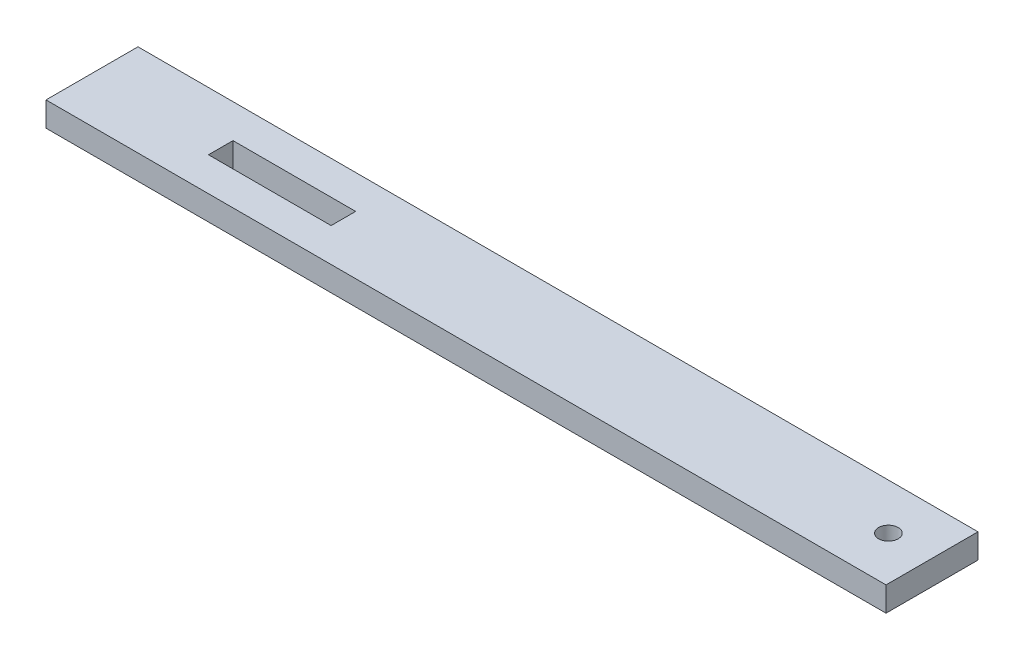
ISO-10303-21;
HEADER;
FILE_DESCRIPTION(('STEP AP214'),'2;1');
FILE_NAME('part.step','',(''),(''),'','','');
FILE_SCHEMA(('AUTOMOTIVE_DESIGN { 1 0 10303 214 1 1 1 1 }'));
ENDSEC;
DATA;
#1=APPLICATION_CONTEXT('core data for automotive mechanical design processes');
#2=APPLICATION_PROTOCOL_DEFINITION('international standard','automotive_design',2000,#1);
#3=PRODUCT_CONTEXT('',#1,'mechanical');
#4=PRODUCT('Part','Part','',(#3));
#5=PRODUCT_RELATED_PRODUCT_CATEGORY('part','',(#4));
#6=PRODUCT_DEFINITION_FORMATION('','',#4);
#7=PRODUCT_DEFINITION_CONTEXT('part definition',#1,'design');
#8=PRODUCT_DEFINITION('design','',#6,#7);
#9=PRODUCT_DEFINITION_SHAPE('','',#8);
#10=(LENGTH_UNIT() NAMED_UNIT(*) SI_UNIT(.MILLI.,.METRE.));
#11=(NAMED_UNIT(*) PLANE_ANGLE_UNIT() SI_UNIT($,.RADIAN.));
#12=(NAMED_UNIT(*) SI_UNIT($,.STERADIAN.) SOLID_ANGLE_UNIT());
#13=UNCERTAINTY_MEASURE_WITH_UNIT(LENGTH_MEASURE(1.E-05),#10,'distance_accuracy_value','');
#14=(GEOMETRIC_REPRESENTATION_CONTEXT(3) GLOBAL_UNCERTAINTY_ASSIGNED_CONTEXT((#13)) GLOBAL_UNIT_ASSIGNED_CONTEXT((#10,
#11,#12)) REPRESENTATION_CONTEXT('',''));
#15=CARTESIAN_POINT('',(0.,0.,0.));
#16=DIRECTION('',(0.,0.,1.));
#17=DIRECTION('',(1.,0.,0.));
#18=AXIS2_PLACEMENT_3D('',#15,#16,#17);
#19=CARTESIAN_POINT('',(-39.37,5.07999999999995,-9.52500000000002));
#20=DIRECTION('',(0.,0.,1.));
#21=DIRECTION('',(1.,0.,0.));
#22=AXIS2_PLACEMENT_3D('',#19,#20,#21);
#23=PLANE('',#22);
#24=DIRECTION('',(-1.,0.,0.));
#25=VECTOR('',#24,1.);
#26=CARTESIAN_POINT('',(-39.37,0.,-9.52500000000001));
#27=LINE('',#26,#25);
#28=CARTESIAN_POINT('',(134.62,0.,-9.52500000000001));
#29=VERTEX_POINT('',#28);
#30=CARTESIAN_POINT('',(-39.37,0.,-9.52500000000001));
#31=VERTEX_POINT('',#30);
#32=EDGE_CURVE('E112',#29,#31,#27,.T.);
#33=ORIENTED_EDGE('',*,*,#32,.T.);
#34=DIRECTION('',(0.,-1.,0.));
#35=VECTOR('',#34,1.);
#36=CARTESIAN_POINT('',(-39.37,5.07999999999995,-9.52500000000002));
#37=LINE('',#36,#35);
#38=CARTESIAN_POINT('',(-39.37,5.07999999999995,-9.52500000000002));
#39=VERTEX_POINT('',#38);
#40=EDGE_CURVE('E11',#39,#31,#37,.T.);
#41=ORIENTED_EDGE('',*,*,#40,.F.);
#42=DIRECTION('',(-1.,0.,0.));
#43=VECTOR('',#42,1.);
#44=CARTESIAN_POINT('',(-39.37,5.07999999999995,-9.52500000000002));
#45=LINE('',#44,#43);
#46=CARTESIAN_POINT('',(134.62,5.07999999999995,-9.52500000000002));
#47=VERTEX_POINT('',#46);
#48=EDGE_CURVE('E106',#47,#39,#45,.T.);
#49=ORIENTED_EDGE('',*,*,#48,.F.);
#50=DIRECTION('',(0.,1.,0.));
#51=VECTOR('',#50,1.);
#52=CARTESIAN_POINT('',(134.62,0.,-9.52500000000001));
#53=LINE('',#52,#51);
#54=EDGE_CURVE('E116',#29,#47,#53,.T.);
#55=ORIENTED_EDGE('',*,*,#54,.F.);
#56=EDGE_LOOP('',(#33,#41,#49,#55));
#57=FACE_BOUND('',#56,.T.);
#58=ADVANCED_FACE('F32',(#57),#23,.F.);
#59=CARTESIAN_POINT('',(-39.37,5.08,9.52499999999998));
#60=DIRECTION('',(1.,0.,0.));
#61=DIRECTION('',(0.,0.,-1.));
#62=AXIS2_PLACEMENT_3D('',#59,#60,#61);
#63=PLANE('',#62);
#64=DIRECTION('',(0.,0.,1.));
#65=VECTOR('',#64,1.);
#66=CARTESIAN_POINT('',(-39.37,0.,9.52500000000001));
#67=LINE('',#66,#65);
#68=CARTESIAN_POINT('',(-39.37,0.,9.52500000000001));
#69=VERTEX_POINT('',#68);
#70=EDGE_CURVE('E107',#31,#69,#67,.T.);
#71=ORIENTED_EDGE('',*,*,#70,.T.);
#72=DIRECTION('',(0.,-1.,0.));
#73=VECTOR('',#72,1.);
#74=CARTESIAN_POINT('',(-39.37,5.08,9.52499999999998));
#75=LINE('',#74,#73);
#76=CARTESIAN_POINT('',(-39.37,5.08,9.52499999999998));
#77=VERTEX_POINT('',#76);
#78=EDGE_CURVE('E39',#77,#69,#75,.T.);
#79=ORIENTED_EDGE('',*,*,#78,.F.);
#80=DIRECTION('',(0.,0.,1.));
#81=VECTOR('',#80,1.);
#82=CARTESIAN_POINT('',(-39.37,5.08,9.52499999999998));
#83=LINE('',#82,#81);
#84=EDGE_CURVE('E160',#39,#77,#83,.T.);
#85=ORIENTED_EDGE('',*,*,#84,.F.);
#86=ORIENTED_EDGE('',*,*,#40,.T.);
#87=EDGE_LOOP('',(#71,#79,#85,#86));
#88=FACE_BOUND('',#87,.T.);
#89=ADVANCED_FACE('F166',(#88),#63,.F.);
#90=CARTESIAN_POINT('',(-39.37,5.08,9.52499999999998));
#91=DIRECTION('',(0.,0.,-1.));
#92=DIRECTION('',(-1.,0.,0.));
#93=AXIS2_PLACEMENT_3D('',#90,#91,#92);
#94=PLANE('',#93);
#95=DIRECTION('',(1.,0.,0.));
#96=VECTOR('',#95,1.);
#97=CARTESIAN_POINT('',(-39.37,0.,9.52500000000001));
#98=LINE('',#97,#96);
#99=CARTESIAN_POINT('',(134.62,0.,9.52500000000001));
#100=VERTEX_POINT('',#99);
#101=EDGE_CURVE('E97',#69,#100,#98,.T.);
#102=ORIENTED_EDGE('',*,*,#101,.T.);
#103=DIRECTION('',(0.,-1.,0.));
#104=VECTOR('',#103,1.);
#105=CARTESIAN_POINT('',(134.62,0.,9.52500000000001));
#106=LINE('',#105,#104);
#107=CARTESIAN_POINT('',(134.62,5.08,9.52499999999998));
#108=VERTEX_POINT('',#107);
#109=EDGE_CURVE('E102',#108,#100,#106,.T.);
#110=ORIENTED_EDGE('',*,*,#109,.F.);
#111=DIRECTION('',(1.,0.,0.));
#112=VECTOR('',#111,1.);
#113=CARTESIAN_POINT('',(-39.37,5.08,9.52499999999998));
#114=LINE('',#113,#112);
#115=EDGE_CURVE('E162',#77,#108,#114,.T.);
#116=ORIENTED_EDGE('',*,*,#115,.F.);
#117=ORIENTED_EDGE('',*,*,#78,.T.);
#118=EDGE_LOOP('',(#102,#110,#116,#117));
#119=FACE_BOUND('',#118,.T.);
#120=ADVANCED_FACE('F99',(#119),#94,.F.);
#121=CARTESIAN_POINT('',(0.,5.08,0.));
#122=DIRECTION('',(0.,-1.,0.));
#123=DIRECTION('',(0.,0.,-1.));
#124=AXIS2_PLACEMENT_3D('',#121,#122,#123);
#125=PLANE('',#124);
#126=CARTESIAN_POINT('',(125.585488770525,5.08,0.));
#127=DIRECTION('',(0.,-1.,0.));
#128=DIRECTION('',(0.,0.,-1.));
#129=AXIS2_PLACEMENT_3D('',#126,#127,#128);
#130=CIRCLE('',#129,2.03200000000001);
#131=CARTESIAN_POINT('',(125.585488770525,5.08,-2.03200000000004));
#132=VERTEX_POINT('',#131);
#133=EDGE_CURVE('E122',#132,#132,#130,.T.);
#134=ORIENTED_EDGE('',*,*,#133,.T.);
#135=EDGE_LOOP('',(#134));
#136=FACE_BOUND('',#135,.T.);
#137=DIRECTION('',(-1.,0.,0.));
#138=VECTOR('',#137,1.);
#139=CARTESIAN_POINT('',(-12.7,5.07999999999995,-2.54000000000003));
#140=LINE('',#139,#138);
#141=CARTESIAN_POINT('',(12.7,5.07999999999995,-2.54000000000003));
#142=VERTEX_POINT('',#141);
#143=CARTESIAN_POINT('',(-12.7,5.07999999999995,-2.54000000000003));
#144=VERTEX_POINT('',#143);
#145=EDGE_CURVE('E144',#142,#144,#140,.T.);
#146=ORIENTED_EDGE('',*,*,#145,.F.);
#147=DIRECTION('',(0.,0.,-1.));
#148=VECTOR('',#147,1.);
#149=CARTESIAN_POINT('',(12.7,5.08,2.53999999999997));
#150=LINE('',#149,#148);
#151=CARTESIAN_POINT('',(12.7,5.08,2.53999999999997));
#152=VERTEX_POINT('',#151);
#153=EDGE_CURVE('E46',#152,#142,#150,.T.);
#154=ORIENTED_EDGE('',*,*,#153,.F.);
#155=DIRECTION('',(1.,0.,0.));
#156=VECTOR('',#155,1.);
#157=CARTESIAN_POINT('',(-12.7,5.08,2.53999999999997));
#158=LINE('',#157,#156);
#159=CARTESIAN_POINT('',(-12.7,5.08,2.53999999999997));
#160=VERTEX_POINT('',#159);
#161=EDGE_CURVE('E135',#160,#152,#158,.T.);
#162=ORIENTED_EDGE('',*,*,#161,.F.);
#163=DIRECTION('',(0.,0.,1.));
#164=VECTOR('',#163,1.);
#165=CARTESIAN_POINT('',(-12.7,5.08,2.53999999999997));
#166=LINE('',#165,#164);
#167=EDGE_CURVE('E147',#144,#160,#166,.T.);
#168=ORIENTED_EDGE('',*,*,#167,.F.);
#169=EDGE_LOOP('',(#146,#154,#162,#168));
#170=FACE_BOUND('',#169,.T.);
#171=ORIENTED_EDGE('',*,*,#115,.T.);
#172=DIRECTION('',(0.,0.,1.));
#173=VECTOR('',#172,1.);
#174=CARTESIAN_POINT('',(134.62,5.08,9.52499999999998));
#175=LINE('',#174,#173);
#176=EDGE_CURVE('E121',#47,#108,#175,.T.);
#177=ORIENTED_EDGE('',*,*,#176,.F.);
#178=ORIENTED_EDGE('',*,*,#48,.T.);
#179=ORIENTED_EDGE('',*,*,#84,.T.);
#180=EDGE_LOOP('',(#171,#177,#178,#179));
#181=FACE_BOUND('',#180,.T.);
#182=ADVANCED_FACE('F171',(#136,#170,#181),#125,.F.);
#183=CARTESIAN_POINT('',(0.,0.,0.));
#184=DIRECTION('',(0.,-1.,0.));
#185=DIRECTION('',(0.,0.,-1.));
#186=AXIS2_PLACEMENT_3D('',#183,#184,#185);
#187=PLANE('',#186);
#188=CARTESIAN_POINT('',(125.585488770525,0.,0.));
#189=DIRECTION('',(0.,-1.,0.));
#190=DIRECTION('',(0.,0.,-1.));
#191=AXIS2_PLACEMENT_3D('',#188,#189,#190);
#192=CIRCLE('',#191,2.03200000000001);
#193=CARTESIAN_POINT('',(125.585488770525,0.,-2.03200000000001));
#194=VERTEX_POINT('',#193);
#195=EDGE_CURVE('E125',#194,#194,#192,.T.);
#196=ORIENTED_EDGE('',*,*,#195,.F.);
#197=EDGE_LOOP('',(#196));
#198=FACE_BOUND('',#197,.T.);
#199=DIRECTION('',(0.,0.,-1.));
#200=VECTOR('',#199,1.);
#201=CARTESIAN_POINT('',(12.7,0.,2.54));
#202=LINE('',#201,#200);
#203=CARTESIAN_POINT('',(12.7,0.,2.54));
#204=VERTEX_POINT('',#203);
#205=CARTESIAN_POINT('',(12.7,0.,-2.54));
#206=VERTEX_POINT('',#205);
#207=EDGE_CURVE('E131',#204,#206,#202,.T.);
#208=ORIENTED_EDGE('',*,*,#207,.T.);
#209=DIRECTION('',(-1.,0.,0.));
#210=VECTOR('',#209,1.);
#211=CARTESIAN_POINT('',(-12.7,0.,-2.54));
#212=LINE('',#211,#210);
#213=CARTESIAN_POINT('',(-12.7,0.,-2.54));
#214=VERTEX_POINT('',#213);
#215=EDGE_CURVE('E134',#206,#214,#212,.T.);
#216=ORIENTED_EDGE('',*,*,#215,.T.);
#217=DIRECTION('',(0.,0.,1.));
#218=VECTOR('',#217,1.);
#219=CARTESIAN_POINT('',(-12.7,0.,2.54));
#220=LINE('',#219,#218);
#221=CARTESIAN_POINT('',(-12.7,0.,2.54));
#222=VERTEX_POINT('',#221);
#223=EDGE_CURVE('E54',#214,#222,#220,.T.);
#224=ORIENTED_EDGE('',*,*,#223,.T.);
#225=DIRECTION('',(1.,0.,0.));
#226=VECTOR('',#225,1.);
#227=CARTESIAN_POINT('',(-12.7,0.,2.54));
#228=LINE('',#227,#226);
#229=EDGE_CURVE('E139',#222,#204,#228,.T.);
#230=ORIENTED_EDGE('',*,*,#229,.T.);
#231=EDGE_LOOP('',(#208,#216,#224,#230));
#232=FACE_BOUND('',#231,.T.);
#233=ORIENTED_EDGE('',*,*,#32,.F.);
#234=DIRECTION('',(0.,0.,-1.));
#235=VECTOR('',#234,1.);
#236=CARTESIAN_POINT('',(134.62,0.,9.52500000000001));
#237=LINE('',#236,#235);
#238=EDGE_CURVE('E110',#100,#29,#237,.T.);
#239=ORIENTED_EDGE('',*,*,#238,.F.);
#240=ORIENTED_EDGE('',*,*,#101,.F.);
#241=ORIENTED_EDGE('',*,*,#70,.F.);
#242=EDGE_LOOP('',(#233,#239,#240,#241));
#243=FACE_BOUND('',#242,.T.);
#244=ADVANCED_FACE('F111',(#198,#232,#243),#187,.T.);
#245=CARTESIAN_POINT('',(12.7,0.,2.54));
#246=DIRECTION('',(1.,0.,0.));
#247=DIRECTION('',(0.,0.,-1.));
#248=AXIS2_PLACEMENT_3D('',#245,#246,#247);
#249=PLANE('',#248);
#250=ORIENTED_EDGE('',*,*,#153,.T.);
#251=DIRECTION('',(0.,1.,0.));
#252=VECTOR('',#251,1.);
#253=CARTESIAN_POINT('',(12.7,0.,-2.54));
#254=LINE('',#253,#252);
#255=EDGE_CURVE('E142',#206,#142,#254,.T.);
#256=ORIENTED_EDGE('',*,*,#255,.F.);
#257=ORIENTED_EDGE('',*,*,#207,.F.);
#258=DIRECTION('',(0.,1.,0.));
#259=VECTOR('',#258,1.);
#260=CARTESIAN_POINT('',(12.7,0.,2.54));
#261=LINE('',#260,#259);
#262=EDGE_CURVE('E152',#204,#152,#261,.T.);
#263=ORIENTED_EDGE('',*,*,#262,.T.);
#264=EDGE_LOOP('',(#250,#256,#257,#263));
#265=FACE_BOUND('',#264,.T.);
#266=ADVANCED_FACE('F179',(#265),#249,.F.);
#267=CARTESIAN_POINT('',(-12.7,0.,2.54));
#268=DIRECTION('',(0.,0.,1.));
#269=DIRECTION('',(1.,0.,0.));
#270=AXIS2_PLACEMENT_3D('',#267,#268,#269);
#271=PLANE('',#270);
#272=ORIENTED_EDGE('',*,*,#161,.T.);
#273=ORIENTED_EDGE('',*,*,#262,.F.);
#274=ORIENTED_EDGE('',*,*,#229,.F.);
#275=DIRECTION('',(0.,1.,0.));
#276=VECTOR('',#275,1.);
#277=CARTESIAN_POINT('',(-12.7,0.,2.54));
#278=LINE('',#277,#276);
#279=EDGE_CURVE('E154',#222,#160,#278,.T.);
#280=ORIENTED_EDGE('',*,*,#279,.T.);
#281=EDGE_LOOP('',(#272,#273,#274,#280));
#282=FACE_BOUND('',#281,.T.);
#283=ADVANCED_FACE('F237',(#282),#271,.F.);
#284=CARTESIAN_POINT('',(-12.7,0.,2.54));
#285=DIRECTION('',(-1.,0.,0.));
#286=DIRECTION('',(0.,0.,1.));
#287=AXIS2_PLACEMENT_3D('',#284,#285,#286);
#288=PLANE('',#287);
#289=ORIENTED_EDGE('',*,*,#167,.T.);
#290=ORIENTED_EDGE('',*,*,#279,.F.);
#291=ORIENTED_EDGE('',*,*,#223,.F.);
#292=DIRECTION('',(0.,1.,0.));
#293=VECTOR('',#292,1.);
#294=CARTESIAN_POINT('',(-12.7,0.,-2.54));
#295=LINE('',#294,#293);
#296=EDGE_CURVE('E156',#214,#144,#295,.T.);
#297=ORIENTED_EDGE('',*,*,#296,.T.);
#298=EDGE_LOOP('',(#289,#290,#291,#297));
#299=FACE_BOUND('',#298,.T.);
#300=ADVANCED_FACE('F240',(#299),#288,.F.);
#301=CARTESIAN_POINT('',(-12.7,0.,-2.54));
#302=DIRECTION('',(0.,0.,-1.));
#303=DIRECTION('',(-1.,0.,0.));
#304=AXIS2_PLACEMENT_3D('',#301,#302,#303);
#305=PLANE('',#304);
#306=ORIENTED_EDGE('',*,*,#145,.T.);
#307=ORIENTED_EDGE('',*,*,#296,.F.);
#308=ORIENTED_EDGE('',*,*,#215,.F.);
#309=ORIENTED_EDGE('',*,*,#255,.T.);
#310=EDGE_LOOP('',(#306,#307,#308,#309));
#311=FACE_BOUND('',#310,.T.);
#312=ADVANCED_FACE('F224',(#311),#305,.F.);
#313=CARTESIAN_POINT('',(134.62,0.,0.));
#314=DIRECTION('',(-1.,0.,0.));
#315=DIRECTION('',(0.,0.,1.));
#316=AXIS2_PLACEMENT_3D('',#313,#314,#315);
#317=PLANE('',#316);
#318=ORIENTED_EDGE('',*,*,#109,.T.);
#319=ORIENTED_EDGE('',*,*,#238,.T.);
#320=ORIENTED_EDGE('',*,*,#54,.T.);
#321=ORIENTED_EDGE('',*,*,#176,.T.);
#322=EDGE_LOOP('',(#318,#319,#320,#321));
#323=FACE_BOUND('',#322,.T.);
#324=ADVANCED_FACE('F119',(#323),#317,.F.);
#325=CARTESIAN_POINT('',(125.585488770525,5.08,0.));
#326=DIRECTION('',(0.,-1.,0.));
#327=DIRECTION('',(0.,0.,-1.));
#328=AXIS2_PLACEMENT_3D('',#325,#326,#327);
#329=CYLINDRICAL_SURFACE('',#328,2.03200000000001);
#330=ORIENTED_EDGE('',*,*,#133,.F.);
#331=EDGE_LOOP('',(#330));
#332=FACE_BOUND('',#331,.T.);
#333=ORIENTED_EDGE('',*,*,#195,.T.);
#334=EDGE_LOOP('',(#333));
#335=FACE_BOUND('',#334,.T.);
#336=ADVANCED_FACE('F223',(#332,#335),#329,.F.);
#337=CLOSED_SHELL('',(#58,#89,#120,#182,#244,#266,#283,#300,#312,#324,#336));
#338=MANIFOLD_SOLID_BREP('B2',#337);
#339=ADVANCED_BREP_SHAPE_REPRESENTATION('',(#18,#338),#14);
#340=SHAPE_DEFINITION_REPRESENTATION(#9,#339);
ENDSEC;
END-ISO-10303-21;
